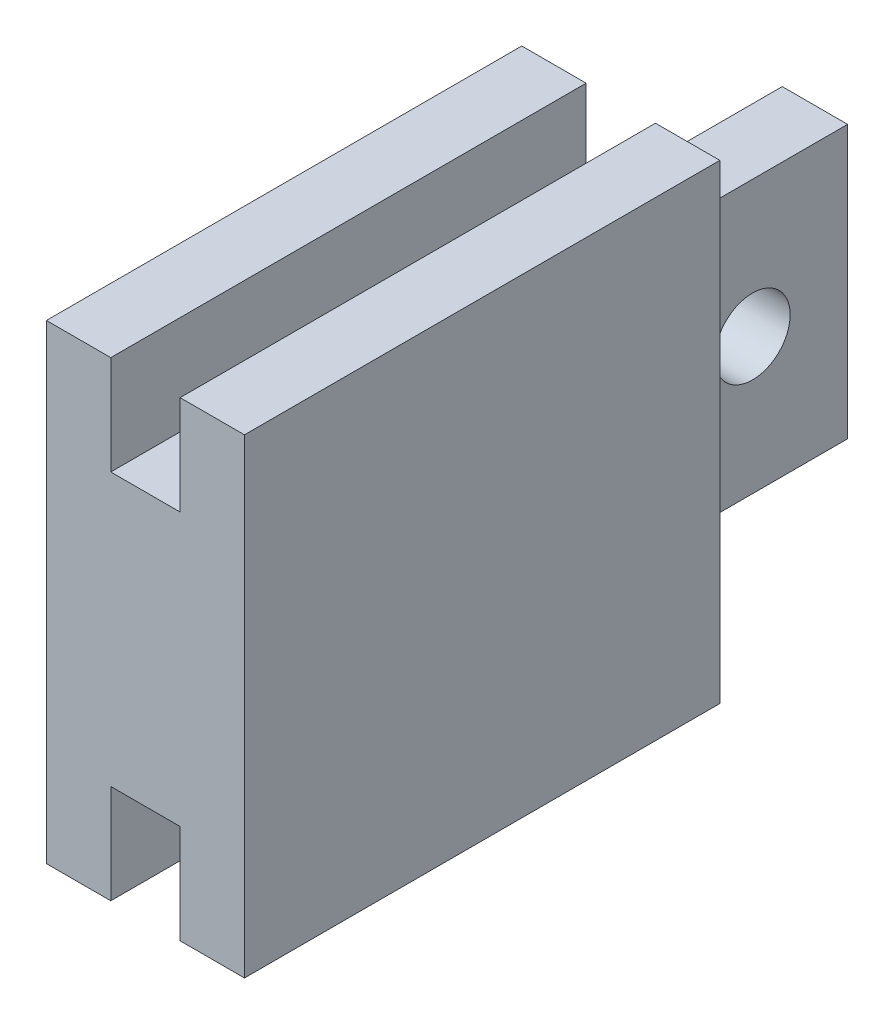
ISO-10303-21;
HEADER;
FILE_DESCRIPTION(('STEP AP214'),'2;1');
FILE_NAME('part.step','',(''),(''),'','','');
FILE_SCHEMA(('AUTOMOTIVE_DESIGN { 1 0 10303 214 1 1 1 1 }'));
ENDSEC;
DATA;
#1=APPLICATION_CONTEXT('core data for automotive mechanical design processes');
#2=APPLICATION_PROTOCOL_DEFINITION('international standard','automotive_design',2000,#1);
#3=PRODUCT_CONTEXT('',#1,'mechanical');
#4=PRODUCT('Part','Part','',(#3));
#5=PRODUCT_RELATED_PRODUCT_CATEGORY('part','',(#4));
#6=PRODUCT_DEFINITION_FORMATION('','',#4);
#7=PRODUCT_DEFINITION_CONTEXT('part definition',#1,'design');
#8=PRODUCT_DEFINITION('design','',#6,#7);
#9=PRODUCT_DEFINITION_SHAPE('','',#8);
#10=(LENGTH_UNIT() NAMED_UNIT(*) SI_UNIT(.MILLI.,.METRE.));
#11=(NAMED_UNIT(*) PLANE_ANGLE_UNIT() SI_UNIT($,.RADIAN.));
#12=(NAMED_UNIT(*) SI_UNIT($,.STERADIAN.) SOLID_ANGLE_UNIT());
#13=UNCERTAINTY_MEASURE_WITH_UNIT(LENGTH_MEASURE(1.E-05),#10,'distance_accuracy_value','');
#14=(GEOMETRIC_REPRESENTATION_CONTEXT(3) GLOBAL_UNCERTAINTY_ASSIGNED_CONTEXT((#13)) GLOBAL_UNIT_ASSIGNED_CONTEXT((#10,
#11,#12)) REPRESENTATION_CONTEXT('',''));
#15=CARTESIAN_POINT('',(0.,0.,0.));
#16=DIRECTION('',(0.,0.,1.));
#17=DIRECTION('',(1.,0.,0.));
#18=AXIS2_PLACEMENT_3D('',#15,#16,#17);
#19=CARTESIAN_POINT('',(-6.65,23.75,0.));
#20=DIRECTION('',(-1.,0.,0.));
#21=DIRECTION('',(0.,0.,1.));
#22=AXIS2_PLACEMENT_3D('',#19,#20,#21);
#23=PLANE('',#22);
#24=CARTESIAN_POINT('',(-6.65,11.875,-5.));
#25=DIRECTION('',(-1.,0.,0.));
#26=DIRECTION('',(0.,0.,1.));
#27=AXIS2_PLACEMENT_3D('',#24,#25,#26);
#28=CIRCLE('',#27,1.9);
#29=CARTESIAN_POINT('',(-6.65,11.875,-3.1));
#30=VERTEX_POINT('',#29);
#31=EDGE_CURVE('E225',#30,#30,#28,.T.);
#32=ORIENTED_EDGE('',*,*,#31,.F.);
#33=EDGE_LOOP('',(#32));
#34=FACE_BOUND('',#33,.T.);
#35=DIRECTION('',(0.,-1.,0.));
#36=VECTOR('',#35,1.);
#37=CARTESIAN_POINT('',(-6.65,23.75,-9.8));
#38=LINE('',#37,#36);
#39=CARTESIAN_POINT('',(-6.65,18.75,-9.8));
#40=VERTEX_POINT('',#39);
#41=CARTESIAN_POINT('',(-6.65,5.,-9.8));
#42=VERTEX_POINT('',#41);
#43=EDGE_CURVE('E238',#40,#42,#38,.T.);
#44=ORIENTED_EDGE('',*,*,#43,.T.);
#45=DIRECTION('',(0.,0.,1.));
#46=VECTOR('',#45,1.);
#47=CARTESIAN_POINT('',(-6.65,5.,0.));
#48=LINE('',#47,#46);
#49=CARTESIAN_POINT('',(-6.65,5.,0.));
#50=VERTEX_POINT('',#49);
#51=EDGE_CURVE('E184',#42,#50,#48,.T.);
#52=ORIENTED_EDGE('',*,*,#51,.T.);
#53=DIRECTION('',(0.,-1.,0.));
#54=VECTOR('',#53,1.);
#55=CARTESIAN_POINT('',(-6.65,23.75,0.));
#56=LINE('',#55,#54);
#57=CARTESIAN_POINT('',(-6.65,18.75,0.));
#58=VERTEX_POINT('',#57);
#59=EDGE_CURVE('E239',#58,#50,#56,.T.);
#60=ORIENTED_EDGE('',*,*,#59,.F.);
#61=DIRECTION('',(0.,0.,1.));
#62=VECTOR('',#61,1.);
#63=CARTESIAN_POINT('',(-6.65,18.75,0.));
#64=LINE('',#63,#62);
#65=EDGE_CURVE('E211',#40,#58,#64,.T.);
#66=ORIENTED_EDGE('',*,*,#65,.F.);
#67=EDGE_LOOP('',(#44,#52,#60,#66));
#68=FACE_BOUND('',#67,.T.);
#69=ADVANCED_FACE('F41',(#34,#68),#23,.T.);
#70=CARTESIAN_POINT('',(-3.35,23.75,0.));
#71=DIRECTION('',(-1.,0.,0.));
#72=DIRECTION('',(0.,0.,1.));
#73=AXIS2_PLACEMENT_3D('',#70,#71,#72);
#74=PLANE('',#73);
#75=CARTESIAN_POINT('',(-3.35,11.875,-5.));
#76=DIRECTION('',(-1.,0.,0.));
#77=DIRECTION('',(0.,0.,1.));
#78=AXIS2_PLACEMENT_3D('',#75,#76,#77);
#79=CIRCLE('',#78,1.9);
#80=CARTESIAN_POINT('',(-3.35,11.875,-3.1));
#81=VERTEX_POINT('',#80);
#82=EDGE_CURVE('E235',#81,#81,#79,.F.);
#83=ORIENTED_EDGE('',*,*,#82,.F.);
#84=EDGE_LOOP('',(#83));
#85=FACE_BOUND('',#84,.T.);
#86=DIRECTION('',(0.,0.,-1.));
#87=VECTOR('',#86,1.);
#88=CARTESIAN_POINT('',(-3.35,5.,0.));
#89=LINE('',#88,#87);
#90=CARTESIAN_POINT('',(-3.35,5.,0.));
#91=VERTEX_POINT('',#90);
#92=CARTESIAN_POINT('',(-3.35,5.,-9.8));
#93=VERTEX_POINT('',#92);
#94=EDGE_CURVE('E190',#91,#93,#89,.T.);
#95=ORIENTED_EDGE('',*,*,#94,.T.);
#96=DIRECTION('',(0.,-1.,0.));
#97=VECTOR('',#96,1.);
#98=CARTESIAN_POINT('',(-3.35,23.75,-9.8));
#99=LINE('',#98,#97);
#100=CARTESIAN_POINT('',(-3.35,18.75,-9.8));
#101=VERTEX_POINT('',#100);
#102=EDGE_CURVE('E246',#101,#93,#99,.T.);
#103=ORIENTED_EDGE('',*,*,#102,.F.);
#104=DIRECTION('',(0.,0.,-1.));
#105=VECTOR('',#104,1.);
#106=CARTESIAN_POINT('',(-3.35,18.75,0.));
#107=LINE('',#106,#105);
#108=CARTESIAN_POINT('',(-3.35,18.75,0.));
#109=VERTEX_POINT('',#108);
#110=EDGE_CURVE('E66',#109,#101,#107,.T.);
#111=ORIENTED_EDGE('',*,*,#110,.F.);
#112=DIRECTION('',(0.,-1.,0.));
#113=VECTOR('',#112,1.);
#114=CARTESIAN_POINT('',(-3.35,23.75,0.));
#115=LINE('',#114,#113);
#116=EDGE_CURVE('E243',#109,#91,#115,.T.);
#117=ORIENTED_EDGE('',*,*,#116,.T.);
#118=EDGE_LOOP('',(#95,#103,#111,#117));
#119=FACE_BOUND('',#118,.T.);
#120=ADVANCED_FACE('F309',(#85,#119),#74,.F.);
#121=CARTESIAN_POINT('',(0.,23.75,-9.8));
#122=DIRECTION('',(0.,0.,-1.));
#123=DIRECTION('',(0.,1.,0.));
#124=AXIS2_PLACEMENT_3D('',#121,#122,#123);
#125=PLANE('',#124);
#126=ORIENTED_EDGE('',*,*,#102,.T.);
#127=DIRECTION('',(-1.,0.,0.));
#128=VECTOR('',#127,1.);
#129=CARTESIAN_POINT('',(0.,5.,-9.8));
#130=LINE('',#129,#128);
#131=EDGE_CURVE('E187',#93,#42,#130,.T.);
#132=ORIENTED_EDGE('',*,*,#131,.T.);
#133=ORIENTED_EDGE('',*,*,#43,.F.);
#134=DIRECTION('',(-1.,0.,0.));
#135=VECTOR('',#134,1.);
#136=CARTESIAN_POINT('',(0.,18.75,-9.8));
#137=LINE('',#136,#135);
#138=EDGE_CURVE('E209',#101,#40,#137,.T.);
#139=ORIENTED_EDGE('',*,*,#138,.F.);
#140=EDGE_LOOP('',(#126,#132,#133,#139));
#141=FACE_BOUND('',#140,.T.);
#142=ADVANCED_FACE('F311',(#141),#125,.T.);
#143=CARTESIAN_POINT('',(-10.,0.,0.));
#144=DIRECTION('',(0.,0.,-1.));
#145=DIRECTION('',(-1.,0.,0.));
#146=AXIS2_PLACEMENT_3D('',#143,#144,#145);
#147=PLANE('',#146);
#148=DIRECTION('',(-1.,0.,0.));
#149=VECTOR('',#148,1.);
#150=CARTESIAN_POINT('',(0.,5.,0.));
#151=LINE('',#150,#149);
#152=CARTESIAN_POINT('',(-6.75,5.,0.));
#153=VERTEX_POINT('',#152);
#154=EDGE_CURVE('E179',#50,#153,#151,.T.);
#155=ORIENTED_EDGE('',*,*,#154,.T.);
#156=DIRECTION('',(0.,-1.,0.));
#157=VECTOR('',#156,1.);
#158=CARTESIAN_POINT('',(-6.75,5.,0.));
#159=LINE('',#158,#157);
#160=CARTESIAN_POINT('',(-6.75,0.,0.));
#161=VERTEX_POINT('',#160);
#162=EDGE_CURVE('E198',#153,#161,#159,.T.);
#163=ORIENTED_EDGE('',*,*,#162,.T.);
#164=DIRECTION('',(1.,0.,0.));
#165=VECTOR('',#164,1.);
#166=CARTESIAN_POINT('',(-10.,0.,0.));
#167=LINE('',#166,#165);
#168=CARTESIAN_POINT('',(-10.,0.,0.));
#169=VERTEX_POINT('',#168);
#170=EDGE_CURVE('E45',#169,#161,#167,.T.);
#171=ORIENTED_EDGE('',*,*,#170,.F.);
#172=DIRECTION('',(0.,1.,0.));
#173=VECTOR('',#172,1.);
#174=CARTESIAN_POINT('',(-10.,0.,0.));
#175=LINE('',#174,#173);
#176=CARTESIAN_POINT('',(-10.,23.75,0.));
#177=VERTEX_POINT('',#176);
#178=EDGE_CURVE('E254',#169,#177,#175,.T.);
#179=ORIENTED_EDGE('',*,*,#178,.T.);
#180=DIRECTION('',(1.,0.,0.));
#181=VECTOR('',#180,1.);
#182=CARTESIAN_POINT('',(-10.,23.75,0.));
#183=LINE('',#182,#181);
#184=CARTESIAN_POINT('',(-6.75,23.75,0.));
#185=VERTEX_POINT('',#184);
#186=EDGE_CURVE('E278',#177,#185,#183,.T.);
#187=ORIENTED_EDGE('',*,*,#186,.T.);
#188=DIRECTION('',(0.,1.,0.));
#189=VECTOR('',#188,1.);
#190=CARTESIAN_POINT('',(-6.75,18.75,0.));
#191=LINE('',#190,#189);
#192=CARTESIAN_POINT('',(-6.75,18.75,0.));
#193=VERTEX_POINT('',#192);
#194=EDGE_CURVE('E229',#193,#185,#191,.T.);
#195=ORIENTED_EDGE('',*,*,#194,.F.);
#196=DIRECTION('',(-1.,0.,0.));
#197=VECTOR('',#196,1.);
#198=CARTESIAN_POINT('',(0.,18.75,0.));
#199=LINE('',#198,#197);
#200=EDGE_CURVE('E207',#58,#193,#199,.T.);
#201=ORIENTED_EDGE('',*,*,#200,.F.);
#202=ORIENTED_EDGE('',*,*,#59,.T.);
#203=EDGE_LOOP('',(#155,#163,#171,#179,#187,#195,#201,#202));
#204=FACE_BOUND('',#203,.T.);
#205=ADVANCED_FACE('F318',(#204),#147,.T.);
#206=CARTESIAN_POINT('',(-10.,0.,0.));
#207=DIRECTION('',(0.,-1.,0.));
#208=DIRECTION('',(0.,0.,-1.));
#209=AXIS2_PLACEMENT_3D('',#206,#207,#208);
#210=PLANE('',#209);
#211=ORIENTED_EDGE('',*,*,#170,.T.);
#212=DIRECTION('',(0.,0.,1.));
#213=VECTOR('',#212,1.);
#214=CARTESIAN_POINT('',(-6.75,0.,0.));
#215=LINE('',#214,#213);
#216=CARTESIAN_POINT('',(-6.75,0.,24.));
#217=VERTEX_POINT('',#216);
#218=EDGE_CURVE('E174',#161,#217,#215,.T.);
#219=ORIENTED_EDGE('',*,*,#218,.T.);
#220=DIRECTION('',(1.,0.,0.));
#221=VECTOR('',#220,1.);
#222=CARTESIAN_POINT('',(-10.,0.,24.));
#223=LINE('',#222,#221);
#224=CARTESIAN_POINT('',(-10.,0.,24.));
#225=VERTEX_POINT('',#224);
#226=EDGE_CURVE('E11',#225,#217,#223,.T.);
#227=ORIENTED_EDGE('',*,*,#226,.F.);
#228=DIRECTION('',(0.,0.,-1.));
#229=VECTOR('',#228,1.);
#230=CARTESIAN_POINT('',(-10.,0.,0.));
#231=LINE('',#230,#229);
#232=EDGE_CURVE('E251',#225,#169,#231,.T.);
#233=ORIENTED_EDGE('',*,*,#232,.T.);
#234=EDGE_LOOP('',(#211,#219,#227,#233));
#235=FACE_BOUND('',#234,.T.);
#236=ADVANCED_FACE('F329',(#235),#210,.T.);
#237=CARTESIAN_POINT('',(-10.,0.,24.));
#238=DIRECTION('',(0.,0.,1.));
#239=DIRECTION('',(1.,0.,0.));
#240=AXIS2_PLACEMENT_3D('',#237,#238,#239);
#241=PLANE('',#240);
#242=DIRECTION('',(0.,-1.,0.));
#243=VECTOR('',#242,1.);
#244=CARTESIAN_POINT('',(-3.25,5.,24.));
#245=LINE('',#244,#243);
#246=CARTESIAN_POINT('',(-3.25,5.,24.));
#247=VERTEX_POINT('',#246);
#248=CARTESIAN_POINT('',(-3.25,0.,24.));
#249=VERTEX_POINT('',#248);
#250=EDGE_CURVE('E156',#247,#249,#245,.T.);
#251=ORIENTED_EDGE('',*,*,#250,.T.);
#252=CARTESIAN_POINT('',(0.,0.,24.));
#253=VERTEX_POINT('',#252);
#254=EDGE_CURVE('E50',#249,#253,#223,.T.);
#255=ORIENTED_EDGE('',*,*,#254,.T.);
#256=DIRECTION('',(0.,-1.,0.));
#257=VECTOR('',#256,1.);
#258=CARTESIAN_POINT('',(0.,0.,24.));
#259=LINE('',#258,#257);
#260=CARTESIAN_POINT('',(0.,23.75,24.));
#261=VERTEX_POINT('',#260);
#262=EDGE_CURVE('E255',#261,#253,#259,.T.);
#263=ORIENTED_EDGE('',*,*,#262,.F.);
#264=DIRECTION('',(1.,0.,0.));
#265=VECTOR('',#264,1.);
#266=CARTESIAN_POINT('',(-10.,23.75,24.));
#267=LINE('',#266,#265);
#268=CARTESIAN_POINT('',(-3.25,23.75,24.));
#269=VERTEX_POINT('',#268);
#270=EDGE_CURVE('E277',#269,#261,#267,.T.);
#271=ORIENTED_EDGE('',*,*,#270,.F.);
#272=DIRECTION('',(0.,1.,0.));
#273=VECTOR('',#272,1.);
#274=CARTESIAN_POINT('',(-3.25,18.75,24.));
#275=LINE('',#274,#273);
#276=CARTESIAN_POINT('',(-3.25,18.75,24.));
#277=VERTEX_POINT('',#276);
#278=EDGE_CURVE('E223',#277,#269,#275,.T.);
#279=ORIENTED_EDGE('',*,*,#278,.F.);
#280=DIRECTION('',(1.,0.,0.));
#281=VECTOR('',#280,1.);
#282=CARTESIAN_POINT('',(0.,18.75,24.));
#283=LINE('',#282,#281);
#284=CARTESIAN_POINT('',(-6.75,18.75,24.));
#285=VERTEX_POINT('',#284);
#286=EDGE_CURVE('E216',#285,#277,#283,.T.);
#287=ORIENTED_EDGE('',*,*,#286,.F.);
#288=DIRECTION('',(0.,1.,0.));
#289=VECTOR('',#288,1.);
#290=CARTESIAN_POINT('',(-6.75,18.75,24.));
#291=LINE('',#290,#289);
#292=CARTESIAN_POINT('',(-6.75,23.75,24.));
#293=VERTEX_POINT('',#292);
#294=EDGE_CURVE('E226',#285,#293,#291,.T.);
#295=ORIENTED_EDGE('',*,*,#294,.T.);
#296=CARTESIAN_POINT('',(-10.,23.75,24.));
#297=VERTEX_POINT('',#296);
#298=EDGE_CURVE('E275',#297,#293,#267,.T.);
#299=ORIENTED_EDGE('',*,*,#298,.F.);
#300=DIRECTION('',(0.,-1.,0.));
#301=VECTOR('',#300,1.);
#302=CARTESIAN_POINT('',(-10.,0.,24.));
#303=LINE('',#302,#301);
#304=EDGE_CURVE('E261',#297,#225,#303,.T.);
#305=ORIENTED_EDGE('',*,*,#304,.T.);
#306=ORIENTED_EDGE('',*,*,#226,.T.);
#307=DIRECTION('',(0.,-1.,0.));
#308=VECTOR('',#307,1.);
#309=CARTESIAN_POINT('',(-6.75,5.,24.));
#310=LINE('',#309,#308);
#311=CARTESIAN_POINT('',(-6.75,5.,24.));
#312=VERTEX_POINT('',#311);
#313=EDGE_CURVE('E58',#312,#217,#310,.T.);
#314=ORIENTED_EDGE('',*,*,#313,.F.);
#315=DIRECTION('',(1.,0.,0.));
#316=VECTOR('',#315,1.);
#317=CARTESIAN_POINT('',(0.,5.,24.));
#318=LINE('',#317,#316);
#319=EDGE_CURVE('E172',#312,#247,#318,.T.);
#320=ORIENTED_EDGE('',*,*,#319,.T.);
#321=EDGE_LOOP('',(#251,#255,#263,#271,#279,#287,#295,#299,#305,#306,#314,#320));
#322=FACE_BOUND('',#321,.T.);
#323=ADVANCED_FACE('F176',(#322),#241,.T.);
#324=CARTESIAN_POINT('',(-10.,23.75,0.));
#325=DIRECTION('',(0.,1.,0.));
#326=DIRECTION('',(0.,0.,1.));
#327=AXIS2_PLACEMENT_3D('',#324,#325,#326);
#328=PLANE('',#327);
#329=CARTESIAN_POINT('',(-3.25,23.75,0.));
#330=VERTEX_POINT('',#329);
#331=CARTESIAN_POINT('',(0.,23.75,0.));
#332=VERTEX_POINT('',#331);
#333=EDGE_CURVE('E280',#330,#332,#183,.T.);
#334=ORIENTED_EDGE('',*,*,#333,.F.);
#335=DIRECTION('',(0.,0.,1.));
#336=VECTOR('',#335,1.);
#337=CARTESIAN_POINT('',(-3.25,23.75,0.));
#338=LINE('',#337,#336);
#339=EDGE_CURVE('E197',#330,#269,#338,.T.);
#340=ORIENTED_EDGE('',*,*,#339,.T.);
#341=ORIENTED_EDGE('',*,*,#270,.T.);
#342=DIRECTION('',(0.,0.,1.));
#343=VECTOR('',#342,1.);
#344=CARTESIAN_POINT('',(0.,23.75,0.));
#345=LINE('',#344,#343);
#346=EDGE_CURVE('E270',#332,#261,#345,.T.);
#347=ORIENTED_EDGE('',*,*,#346,.F.);
#348=EDGE_LOOP('',(#334,#340,#341,#347));
#349=FACE_BOUND('',#348,.T.);
#350=ADVANCED_FACE('F300',(#349),#328,.T.);
#351=DIRECTION('',(0.,-1.,0.));
#352=VECTOR('',#351,1.);
#353=CARTESIAN_POINT('',(-3.25,5.,0.));
#354=LINE('',#353,#352);
#355=CARTESIAN_POINT('',(-3.25,5.,0.));
#356=VERTEX_POINT('',#355);
#357=CARTESIAN_POINT('',(-3.25,0.,0.));
#358=VERTEX_POINT('',#357);
#359=EDGE_CURVE('E195',#356,#358,#354,.T.);
#360=ORIENTED_EDGE('',*,*,#359,.F.);
#361=EDGE_CURVE('E166',#356,#91,#151,.T.);
#362=ORIENTED_EDGE('',*,*,#361,.T.);
#363=ORIENTED_EDGE('',*,*,#116,.F.);
#364=CARTESIAN_POINT('',(-3.25,18.75,0.));
#365=VERTEX_POINT('',#364);
#366=EDGE_CURVE('E204',#365,#109,#199,.T.);
#367=ORIENTED_EDGE('',*,*,#366,.F.);
#368=DIRECTION('',(0.,1.,0.));
#369=VECTOR('',#368,1.);
#370=CARTESIAN_POINT('',(-3.25,18.75,0.));
#371=LINE('',#370,#369);
#372=EDGE_CURVE('E219',#365,#330,#371,.T.);
#373=ORIENTED_EDGE('',*,*,#372,.T.);
#374=ORIENTED_EDGE('',*,*,#333,.T.);
#375=DIRECTION('',(0.,1.,0.));
#376=VECTOR('',#375,1.);
#377=CARTESIAN_POINT('',(0.,0.,0.));
#378=LINE('',#377,#376);
#379=CARTESIAN_POINT('',(0.,0.,0.));
#380=VERTEX_POINT('',#379);
#381=EDGE_CURVE('E267',#380,#332,#378,.T.);
#382=ORIENTED_EDGE('',*,*,#381,.F.);
#383=EDGE_CURVE('E264',#358,#380,#167,.T.);
#384=ORIENTED_EDGE('',*,*,#383,.F.);
#385=EDGE_LOOP('',(#360,#362,#363,#367,#373,#374,#382,#384));
#386=FACE_BOUND('',#385,.T.);
#387=ADVANCED_FACE('F292',(#386),#147,.T.);
#388=DIRECTION('',(0.,0.,1.));
#389=VECTOR('',#388,1.);
#390=CARTESIAN_POINT('',(-3.25,0.,0.));
#391=LINE('',#390,#389);
#392=EDGE_CURVE('E162',#358,#249,#391,.T.);
#393=ORIENTED_EDGE('',*,*,#392,.F.);
#394=ORIENTED_EDGE('',*,*,#383,.T.);
#395=DIRECTION('',(0.,0.,-1.));
#396=VECTOR('',#395,1.);
#397=CARTESIAN_POINT('',(0.,0.,0.));
#398=LINE('',#397,#396);
#399=EDGE_CURVE('E242',#253,#380,#398,.T.);
#400=ORIENTED_EDGE('',*,*,#399,.F.);
#401=ORIENTED_EDGE('',*,*,#254,.F.);
#402=EDGE_LOOP('',(#393,#394,#400,#401));
#403=FACE_BOUND('',#402,.T.);
#404=ADVANCED_FACE('F43',(#403),#210,.T.);
#405=DIRECTION('',(0.,0.,1.));
#406=VECTOR('',#405,1.);
#407=CARTESIAN_POINT('',(-6.75,23.75,0.));
#408=LINE('',#407,#406);
#409=EDGE_CURVE('E205',#185,#293,#408,.T.);
#410=ORIENTED_EDGE('',*,*,#409,.F.);
#411=ORIENTED_EDGE('',*,*,#186,.F.);
#412=DIRECTION('',(0.,0.,1.));
#413=VECTOR('',#412,1.);
#414=CARTESIAN_POINT('',(-10.,23.75,0.));
#415=LINE('',#414,#413);
#416=EDGE_CURVE('E258',#177,#297,#415,.T.);
#417=ORIENTED_EDGE('',*,*,#416,.T.);
#418=ORIENTED_EDGE('',*,*,#298,.T.);
#419=EDGE_LOOP('',(#410,#411,#417,#418));
#420=FACE_BOUND('',#419,.T.);
#421=ADVANCED_FACE('F322',(#420),#328,.T.);
#422=CARTESIAN_POINT('',(-10.,0.,0.));
#423=DIRECTION('',(-1.,0.,0.));
#424=DIRECTION('',(0.,0.,1.));
#425=AXIS2_PLACEMENT_3D('',#422,#423,#424);
#426=PLANE('',#425);
#427=ORIENTED_EDGE('',*,*,#232,.F.);
#428=ORIENTED_EDGE('',*,*,#304,.F.);
#429=ORIENTED_EDGE('',*,*,#416,.F.);
#430=ORIENTED_EDGE('',*,*,#178,.F.);
#431=EDGE_LOOP('',(#427,#428,#429,#430));
#432=FACE_BOUND('',#431,.T.);
#433=ADVANCED_FACE('F328',(#432),#426,.T.);
#434=CARTESIAN_POINT('',(0.,0.,0.));
#435=DIRECTION('',(-1.,0.,0.));
#436=DIRECTION('',(0.,0.,1.));
#437=AXIS2_PLACEMENT_3D('',#434,#435,#436);
#438=PLANE('',#437);
#439=ORIENTED_EDGE('',*,*,#399,.T.);
#440=ORIENTED_EDGE('',*,*,#381,.T.);
#441=ORIENTED_EDGE('',*,*,#346,.T.);
#442=ORIENTED_EDGE('',*,*,#262,.T.);
#443=EDGE_LOOP('',(#439,#440,#441,#442));
#444=FACE_BOUND('',#443,.T.);
#445=ADVANCED_FACE('F294',(#444),#438,.F.);
#446=CARTESIAN_POINT('',(0.00100000000000013,11.875,-5.));
#447=DIRECTION('',(-1.,0.,0.));
#448=DIRECTION('',(0.,0.,1.));
#449=AXIS2_PLACEMENT_3D('',#446,#447,#448);
#450=CYLINDRICAL_SURFACE('',#449,1.9);
#451=CARTESIAN_POINT('',(-6.65,11.875,-3.1));
#452=CARTESIAN_POINT('',(-6.615625,11.875,-3.1));
#453=CARTESIAN_POINT('',(-6.58125,11.875,-3.1));
#454=CARTESIAN_POINT('',(-6.5125,11.875,-3.1));
#455=CARTESIAN_POINT('',(-6.478125,11.875,-3.1));
#456=CARTESIAN_POINT('',(-6.409375,11.875,-3.1));
#457=CARTESIAN_POINT('',(-6.375,11.875,-3.1));
#458=CARTESIAN_POINT('',(-6.30625,11.875,-3.1));
#459=CARTESIAN_POINT('',(-6.271875,11.875,-3.1));
#460=CARTESIAN_POINT('',(-6.203125,11.875,-3.1));
#461=CARTESIAN_POINT('',(-6.16875,11.875,-3.1));
#462=CARTESIAN_POINT('',(-6.1,11.875,-3.1));
#463=CARTESIAN_POINT('',(-6.065625,11.875,-3.1));
#464=CARTESIAN_POINT('',(-5.996875,11.875,-3.1));
#465=CARTESIAN_POINT('',(-5.9625,11.875,-3.1));
#466=CARTESIAN_POINT('',(-5.89375,11.875,-3.1));
#467=CARTESIAN_POINT('',(-5.859375,11.875,-3.1));
#468=CARTESIAN_POINT('',(-5.790625,11.875,-3.1));
#469=CARTESIAN_POINT('',(-5.75625,11.875,-3.1));
#470=CARTESIAN_POINT('',(-5.6875,11.875,-3.1));
#471=CARTESIAN_POINT('',(-5.653125,11.875,-3.1));
#472=CARTESIAN_POINT('',(-5.584375,11.875,-3.1));
#473=CARTESIAN_POINT('',(-5.55,11.875,-3.1));
#474=CARTESIAN_POINT('',(-5.48125,11.875,-3.1));
#475=CARTESIAN_POINT('',(-5.446875,11.875,-3.1));
#476=CARTESIAN_POINT('',(-5.378125,11.875,-3.1));
#477=CARTESIAN_POINT('',(-5.34375,11.875,-3.1));
#478=CARTESIAN_POINT('',(-5.275,11.875,-3.1));
#479=CARTESIAN_POINT('',(-5.240625,11.875,-3.1));
#480=CARTESIAN_POINT('',(-5.171875,11.875,-3.1));
#481=CARTESIAN_POINT('',(-5.1375,11.875,-3.1));
#482=CARTESIAN_POINT('',(-5.06875,11.875,-3.1));
#483=CARTESIAN_POINT('',(-5.034375,11.875,-3.1));
#484=CARTESIAN_POINT('',(-4.965625,11.875,-3.1));
#485=CARTESIAN_POINT('',(-4.93125,11.875,-3.1));
#486=CARTESIAN_POINT('',(-4.8625,11.875,-3.1));
#487=CARTESIAN_POINT('',(-4.828125,11.875,-3.1));
#488=CARTESIAN_POINT('',(-4.759375,11.875,-3.1));
#489=CARTESIAN_POINT('',(-4.725,11.875,-3.1));
#490=CARTESIAN_POINT('',(-4.65625,11.875,-3.1));
#491=CARTESIAN_POINT('',(-4.621875,11.875,-3.1));
#492=CARTESIAN_POINT('',(-4.553125,11.875,-3.1));
#493=CARTESIAN_POINT('',(-4.51875,11.875,-3.1));
#494=CARTESIAN_POINT('',(-4.45,11.875,-3.1));
#495=CARTESIAN_POINT('',(-4.415625,11.875,-3.1));
#496=CARTESIAN_POINT('',(-4.346875,11.875,-3.1));
#497=CARTESIAN_POINT('',(-4.3125,11.875,-3.1));
#498=CARTESIAN_POINT('',(-4.24375,11.875,-3.1));
#499=CARTESIAN_POINT('',(-4.209375,11.875,-3.1));
#500=CARTESIAN_POINT('',(-4.140625,11.875,-3.1));
#501=CARTESIAN_POINT('',(-4.10625,11.875,-3.1));
#502=CARTESIAN_POINT('',(-4.0375,11.875,-3.1));
#503=CARTESIAN_POINT('',(-4.003125,11.875,-3.1));
#504=CARTESIAN_POINT('',(-3.934375,11.875,-3.1));
#505=CARTESIAN_POINT('',(-3.9,11.875,-3.1));
#506=CARTESIAN_POINT('',(-3.83125,11.875,-3.1));
#507=CARTESIAN_POINT('',(-3.796875,11.875,-3.1));
#508=CARTESIAN_POINT('',(-3.728125,11.875,-3.1));
#509=CARTESIAN_POINT('',(-3.69375,11.875,-3.1));
#510=CARTESIAN_POINT('',(-3.625,11.875,-3.1));
#511=CARTESIAN_POINT('',(-3.590625,11.875,-3.1));
#512=CARTESIAN_POINT('',(-3.521875,11.875,-3.1));
#513=CARTESIAN_POINT('',(-3.4875,11.875,-3.1));
#514=CARTESIAN_POINT('',(-3.41875,11.875,-3.1));
#515=CARTESIAN_POINT('',(-3.384375,11.875,-3.1));
#516=CARTESIAN_POINT('',(-3.35,11.875,-3.1));
#517=B_SPLINE_CURVE_WITH_KNOTS('',3,(#451,#452,#453,#454,#455,#456,#457,#458,#459,#460,#461,
#462,#463,#464,#465,#466,#467,#468,#469,#470,#471,#472,#473,#474,#475,#476,#477,#478,#479,#480,
#481,#482,#483,#484,#485,#486,#487,#488,#489,#490,#491,#492,#493,#494,#495,#496,#497,#498,#499,
#500,#501,#502,#503,#504,#505,#506,#507,#508,#509,#510,#511,#512,#513,#514,#515,#516),
.UNSPECIFIED.,.F.,.F.,(4,2,2,2,2,2,2,2,2,2,2,2,2,2,2,2,2,2,2,2,2,2,2,2,2,2,2,2,2,2,2,2,4),(0.,
0.103125,0.20625,0.309375,0.4125,0.515625,0.618749999999999,0.721875,0.824999999999999,0.928125,
1.03125,1.134375,1.2375,1.340625,1.44375,1.546875,1.65,1.753125,1.85625,1.959375,2.0625,
2.165625,2.26875,2.371875,2.475,2.578125,2.68125,2.784375,2.8875,2.990625,3.09375,3.196875,3.3),.UNSPECIFIED.);
#518=EDGE_CURVE('BSEAM355',#30,#81,#517,.T.);
#519=ORIENTED_EDGE('',*,*,#31,.T.);
#520=ORIENTED_EDGE('',*,*,#82,.T.);
#521=ORIENTED_EDGE('',*,*,#518,.T.);
#522=ORIENTED_EDGE('',*,*,#518,.F.);
#523=EDGE_LOOP('',(#519,#521,#520,#522));
#524=FACE_BOUND('',#523,.T.);
#525=ADVANCED_FACE('F355',(#524),#450,.F.);
#526=CARTESIAN_POINT('',(-3.25,18.75,0.));
#527=DIRECTION('',(-1.,0.,0.));
#528=DIRECTION('',(0.,0.,1.));
#529=AXIS2_PLACEMENT_3D('',#526,#527,#528);
#530=PLANE('',#529);
#531=ORIENTED_EDGE('',*,*,#339,.F.);
#532=ORIENTED_EDGE('',*,*,#372,.F.);
#533=DIRECTION('',(0.,0.,1.));
#534=VECTOR('',#533,1.);
#535=CARTESIAN_POINT('',(-3.25,18.75,0.));
#536=LINE('',#535,#534);
#537=EDGE_CURVE('E202',#365,#277,#536,.T.);
#538=ORIENTED_EDGE('',*,*,#537,.T.);
#539=ORIENTED_EDGE('',*,*,#278,.T.);
#540=EDGE_LOOP('',(#531,#532,#538,#539));
#541=FACE_BOUND('',#540,.T.);
#542=ADVANCED_FACE('F302',(#541),#530,.T.);
#543=CARTESIAN_POINT('',(-6.75,18.75,0.));
#544=DIRECTION('',(-1.,0.,0.));
#545=DIRECTION('',(0.,0.,1.));
#546=AXIS2_PLACEMENT_3D('',#543,#544,#545);
#547=PLANE('',#546);
#548=ORIENTED_EDGE('',*,*,#409,.T.);
#549=ORIENTED_EDGE('',*,*,#294,.F.);
#550=DIRECTION('',(0.,0.,1.));
#551=VECTOR('',#550,1.);
#552=CARTESIAN_POINT('',(-6.75,18.75,0.));
#553=LINE('',#552,#551);
#554=EDGE_CURVE('E213',#193,#285,#553,.T.);
#555=ORIENTED_EDGE('',*,*,#554,.F.);
#556=ORIENTED_EDGE('',*,*,#194,.T.);
#557=EDGE_LOOP('',(#548,#549,#555,#556));
#558=FACE_BOUND('',#557,.T.);
#559=ADVANCED_FACE('F480',(#558),#547,.F.);
#560=CARTESIAN_POINT('',(0.,18.75,0.));
#561=DIRECTION('',(0.,1.,0.));
#562=DIRECTION('',(0.,0.,1.));
#563=AXIS2_PLACEMENT_3D('',#560,#561,#562);
#564=PLANE('',#563);
#565=ORIENTED_EDGE('',*,*,#537,.F.);
#566=ORIENTED_EDGE('',*,*,#366,.T.);
#567=ORIENTED_EDGE('',*,*,#110,.T.);
#568=ORIENTED_EDGE('',*,*,#138,.T.);
#569=ORIENTED_EDGE('',*,*,#65,.T.);
#570=ORIENTED_EDGE('',*,*,#200,.T.);
#571=ORIENTED_EDGE('',*,*,#554,.T.);
#572=ORIENTED_EDGE('',*,*,#286,.T.);
#573=EDGE_LOOP('',(#565,#566,#567,#568,#569,#570,#571,#572));
#574=FACE_BOUND('',#573,.T.);
#575=ADVANCED_FACE('F306',(#574),#564,.T.);
#576=CARTESIAN_POINT('',(-3.25,5.,0.));
#577=DIRECTION('',(1.,0.,0.));
#578=DIRECTION('',(0.,0.,-1.));
#579=AXIS2_PLACEMENT_3D('',#576,#577,#578);
#580=PLANE('',#579);
#581=ORIENTED_EDGE('',*,*,#392,.T.);
#582=ORIENTED_EDGE('',*,*,#250,.F.);
#583=DIRECTION('',(0.,0.,1.));
#584=VECTOR('',#583,1.);
#585=CARTESIAN_POINT('',(-3.25,5.,0.));
#586=LINE('',#585,#584);
#587=EDGE_CURVE('E159',#356,#247,#586,.T.);
#588=ORIENTED_EDGE('',*,*,#587,.F.);
#589=ORIENTED_EDGE('',*,*,#359,.T.);
#590=EDGE_LOOP('',(#581,#582,#588,#589));
#591=FACE_BOUND('',#590,.T.);
#592=ADVANCED_FACE('F158',(#591),#580,.F.);
#593=CARTESIAN_POINT('',(-6.75,5.,0.));
#594=DIRECTION('',(1.,0.,0.));
#595=DIRECTION('',(0.,0.,-1.));
#596=AXIS2_PLACEMENT_3D('',#593,#594,#595);
#597=PLANE('',#596);
#598=ORIENTED_EDGE('',*,*,#218,.F.);
#599=ORIENTED_EDGE('',*,*,#162,.F.);
#600=DIRECTION('',(0.,0.,1.));
#601=VECTOR('',#600,1.);
#602=CARTESIAN_POINT('',(-6.75,5.,0.));
#603=LINE('',#602,#601);
#604=EDGE_CURVE('E177',#153,#312,#603,.T.);
#605=ORIENTED_EDGE('',*,*,#604,.T.);
#606=ORIENTED_EDGE('',*,*,#313,.T.);
#607=EDGE_LOOP('',(#598,#599,#605,#606));
#608=FACE_BOUND('',#607,.T.);
#609=ADVANCED_FACE('F330',(#608),#597,.T.);
#610=CARTESIAN_POINT('',(0.,5.,0.));
#611=DIRECTION('',(0.,-1.,0.));
#612=DIRECTION('',(0.,0.,1.));
#613=AXIS2_PLACEMENT_3D('',#610,#611,#612);
#614=PLANE('',#613);
#615=ORIENTED_EDGE('',*,*,#587,.T.);
#616=ORIENTED_EDGE('',*,*,#319,.F.);
#617=ORIENTED_EDGE('',*,*,#604,.F.);
#618=ORIENTED_EDGE('',*,*,#154,.F.);
#619=ORIENTED_EDGE('',*,*,#51,.F.);
#620=ORIENTED_EDGE('',*,*,#131,.F.);
#621=ORIENTED_EDGE('',*,*,#94,.F.);
#622=ORIENTED_EDGE('',*,*,#361,.F.);
#623=EDGE_LOOP('',(#615,#616,#617,#618,#619,#620,#621,#622));
#624=FACE_BOUND('',#623,.T.);
#625=ADVANCED_FACE('F170',(#624),#614,.T.);
#626=CLOSED_SHELL('',(#69,#120,#142,#205,#236,#323,#350,#387,#404,#421,#433,#445,#525,#542,#559,
#575,#592,#609,#625));
#627=MANIFOLD_SOLID_BREP('B2',#626);
#628=ADVANCED_BREP_SHAPE_REPRESENTATION('',(#18,#627),#14);
#629=SHAPE_DEFINITION_REPRESENTATION(#9,#628);
ENDSEC;
END-ISO-10303-21;
